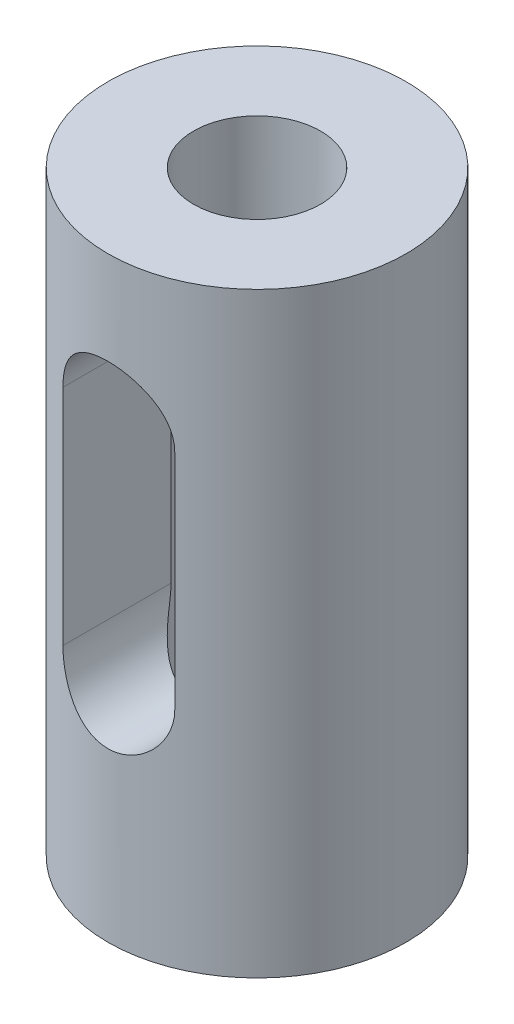
ISO-10303-21;
HEADER;
FILE_DESCRIPTION(('STEP AP214'),'2;1');
FILE_NAME('part.step','',(''),(''),'','','');
FILE_SCHEMA(('AUTOMOTIVE_DESIGN { 1 0 10303 214 1 1 1 1 }'));
ENDSEC;
DATA;
#1=APPLICATION_CONTEXT('core data for automotive mechanical design processes');
#2=APPLICATION_PROTOCOL_DEFINITION('international standard','automotive_design',2000,#1);
#3=PRODUCT_CONTEXT('',#1,'mechanical');
#4=PRODUCT('Part','Part','',(#3));
#5=PRODUCT_RELATED_PRODUCT_CATEGORY('part','',(#4));
#6=PRODUCT_DEFINITION_FORMATION('','',#4);
#7=PRODUCT_DEFINITION_CONTEXT('part definition',#1,'design');
#8=PRODUCT_DEFINITION('design','',#6,#7);
#9=PRODUCT_DEFINITION_SHAPE('','',#8);
#10=(LENGTH_UNIT() NAMED_UNIT(*) SI_UNIT(.MILLI.,.METRE.));
#11=(NAMED_UNIT(*) PLANE_ANGLE_UNIT() SI_UNIT($,.RADIAN.));
#12=(NAMED_UNIT(*) SI_UNIT($,.STERADIAN.) SOLID_ANGLE_UNIT());
#13=UNCERTAINTY_MEASURE_WITH_UNIT(LENGTH_MEASURE(1.E-05),#10,'distance_accuracy_value','');
#14=(GEOMETRIC_REPRESENTATION_CONTEXT(3) GLOBAL_UNCERTAINTY_ASSIGNED_CONTEXT((#13)) GLOBAL_UNIT_ASSIGNED_CONTEXT((#10,
#11,#12)) REPRESENTATION_CONTEXT('',''));
#15=CARTESIAN_POINT('',(0.,0.,0.));
#16=DIRECTION('',(0.,0.,1.));
#17=DIRECTION('',(1.,0.,0.));
#18=AXIS2_PLACEMENT_3D('',#15,#16,#17);
#19=CARTESIAN_POINT('',(0.,12.7,0.));
#20=DIRECTION('',(0.,-1.,0.));
#21=DIRECTION('',(0.,0.,-1.));
#22=AXIS2_PLACEMENT_3D('',#19,#20,#21);
#23=CYLINDRICAL_SURFACE('',#22,3.175);
#24=DIRECTION('',(0.,-1.,0.));
#25=VECTOR('',#24,1.);
#26=CARTESIAN_POINT('',(-1.190625,12.7,-2.94330377456609));
#27=LINE('',#26,#25);
#28=CARTESIAN_POINT('',(-1.190625,9.525,-2.94330377456609));
#29=VERTEX_POINT('',#28);
#30=CARTESIAN_POINT('',(-1.190625,4.7625,-2.94330377456609));
#31=VERTEX_POINT('',#30);
#32=EDGE_CURVE('E166',#29,#31,#27,.T.);
#33=ORIENTED_EDGE('',*,*,#32,.T.);
#34=CARTESIAN_POINT('',(-1.190625,4.7625,-2.94330377456609));
#35=CARTESIAN_POINT('',(-1.19062618848073,4.73027967690778,-2.94329995872857));
#36=CARTESIAN_POINT('',(-1.18931625076439,4.69807613112784,-2.94383351554502));
#37=CARTESIAN_POINT('',(-1.18409962328059,4.63392477238517,-2.94593703117006));
#38=CARTESIAN_POINT('',(-1.18019380538843,4.60197687720228,-2.94750664199916));
#39=CARTESIAN_POINT('',(-1.16466526629548,4.50709727251809,-2.95369436887438));
#40=CARTESIAN_POINT('',(-1.14923092772087,4.44484151969469,-2.95979205795841));
#41=CARTESIAN_POINT('',(-1.10879122478177,4.32405828217862,-2.97517516785815));
#42=CARTESIAN_POINT('',(-1.08379392479305,4.26552770444891,-2.98445790207025));
#43=CARTESIAN_POINT('',(-1.02500190069595,4.15342901845132,-3.00515645633822));
#44=CARTESIAN_POINT('',(-0.99119997623926,4.09986502065264,-3.01657402007336));
#45=CARTESIAN_POINT('',(-0.91397616823413,3.99661703854706,-3.04088474426552));
#46=CARTESIAN_POINT('',(-0.870190267274443,3.94721555113495,-3.05382115655563));
#47=CARTESIAN_POINT('',(-0.775013201823314,3.85625689804242,-3.07935139516824));
#48=CARTESIAN_POINT('',(-0.723620568591074,3.81470125080481,-3.09194515477271));
#49=CARTESIAN_POINT('',(-0.612531890043652,3.73924495493618,-3.11588859526652));
#50=CARTESIAN_POINT('',(-0.552612693952159,3.70565314820732,-3.1271813121393));
#51=CARTESIAN_POINT('',(-0.427476937704532,3.64914504557796,-3.14672690537256));
#52=CARTESIAN_POINT('',(-0.362262363264181,3.62622476946978,-3.15498091485232));
#53=CARTESIAN_POINT('',(-0.231370227719778,3.59270481068537,-3.16721085556145));
#54=CARTESIAN_POINT('',(-0.165833940311951,3.58161638870874,-3.17135594220028));
#55=CARTESIAN_POINT('',(-0.0337072593735778,3.57050879914146,-3.17550811124661));
#56=CARTESIAN_POINT('',(0.0328828035241815,3.57048622578848,-3.17551646682561));
#57=CARTESIAN_POINT('',(0.161721879430094,3.58122680869424,-3.17150165938149));
#58=CARTESIAN_POINT('',(0.224022668288449,3.59145639594589,-3.16767793539666));
#59=CARTESIAN_POINT('',(0.345948219071124,3.62151316519528,-3.15669026926481));
#60=CARTESIAN_POINT('',(0.405572828828377,3.64134089218802,-3.14952613744589));
#61=CARTESIAN_POINT('',(0.521484953024784,3.69027899912289,-3.13243730414583));
#62=CARTESIAN_POINT('',(0.577711250922168,3.71952031123296,-3.12247393335648));
#63=CARTESIAN_POINT('',(0.684598615222709,3.78633992982367,-3.10079480626558));
#64=CARTESIAN_POINT('',(0.735257863666696,3.8239209476687,-3.08907848045636));
#65=CARTESIAN_POINT('',(0.832712013169232,3.90891961062108,-3.06429285419527));
#66=CARTESIAN_POINT('',(0.879108122886125,3.95678373006591,-3.05118449980405));
#67=CARTESIAN_POINT('',(0.963372193449838,4.05970115666237,-3.02563755595115));
#68=CARTESIAN_POINT('',(1.00123680232957,4.1147572761264,-3.01319923119479));
#69=CARTESIAN_POINT('',(1.06813348661141,4.23208293505346,-2.99015045178193));
#70=CARTESIAN_POINT('',(1.09694552938089,4.29448785949868,-2.97958790430647));
#71=CARTESIAN_POINT('',(1.14346922163723,4.423732517962,-2.96204837787692));
#72=CARTESIAN_POINT('',(1.16119952777849,4.49056458766553,-2.95506537616461));
#73=CARTESIAN_POINT('',(1.17887172316472,4.59214618275791,-2.94803692564227));
#74=CARTESIAN_POINT('',(1.18327510053614,4.62605622405695,-2.94626884394537));
#75=CARTESIAN_POINT('',(1.18915107766906,4.69413754216694,-2.94390042682448));
#76=CARTESIAN_POINT('',(1.1906264013445,4.7283085464671,-2.94329900608927));
#77=CARTESIAN_POINT('',(1.190625,4.7625,-2.94330377456609));
#78=B_SPLINE_CURVE_WITH_KNOTS('',3,(#34,#35,#36,#37,#38,#39,#40,#41,#42,#43,#44,#45,#46,#47,#48,
#49,#50,#51,#52,#53,#54,#55,#56,#57,#58,#59,#60,#61,#62,#63,#64,#65,#66,#67,#68,#69,#70,#71,#72,
#73,#74,#75,#76,#77),.UNSPECIFIED.,.F.,.F.,(4,2,2,2,2,2,2,2,2,2,2,2,2,2,2,2,2,2,2,2,2,4),(0.,
0.0965973633725355,0.19316229908422,0.385439495019381,0.5775549011506,0.769827913629832,
0.97074059264154,1.171692115472,1.37948621931291,1.58720275906572,1.78596071876867,
1.98465750622697,2.17352376479971,2.36240074870515,2.5540273495621,2.74571634263585,
2.94860657699107,3.151576387038,3.35915405166445,3.5663813009329,3.66897446974835,
3.77147215322594),.UNSPECIFIED.);
#79=CARTESIAN_POINT('',(1.190625,4.7625,-2.94330377456609));
#80=VERTEX_POINT('',#79);
#81=EDGE_CURVE('E122',#31,#80,#78,.T.);
#82=ORIENTED_EDGE('',*,*,#81,.T.);
#83=DIRECTION('',(0.,-1.,0.));
#84=VECTOR('',#83,1.);
#85=CARTESIAN_POINT('',(1.190625,12.7,-2.94330377456609));
#86=LINE('',#85,#84);
#87=CARTESIAN_POINT('',(1.190625,9.525,-2.94330377456609));
#88=VERTEX_POINT('',#87);
#89=EDGE_CURVE('E172',#80,#88,#86,.F.);
#90=ORIENTED_EDGE('',*,*,#89,.T.);
#91=CARTESIAN_POINT('',(1.190625,9.525,-2.94330377456609));
#92=CARTESIAN_POINT('',(1.19062618848073,9.55722032309222,-2.94329995872857));
#93=CARTESIAN_POINT('',(1.18931625076439,9.58942386887216,-2.94383351554502));
#94=CARTESIAN_POINT('',(1.18409962328059,9.65357522761483,-2.94593703117006));
#95=CARTESIAN_POINT('',(1.18019380538843,9.68552312279772,-2.94750664199916));
#96=CARTESIAN_POINT('',(1.16466526629548,9.7804027274819,-2.95369436887438));
#97=CARTESIAN_POINT('',(1.14923092772087,9.84265848030531,-2.95979205795841));
#98=CARTESIAN_POINT('',(1.10879122478177,9.96344171782138,-2.97517516785815));
#99=CARTESIAN_POINT('',(1.08379392479305,10.0219722955511,-2.98445790207025));
#100=CARTESIAN_POINT('',(1.02500190069595,10.1340709815487,-3.00515645633822));
#101=CARTESIAN_POINT('',(0.99119997623926,10.1876349793474,-3.01657402007336));
#102=CARTESIAN_POINT('',(0.91397616823413,10.2908829614529,-3.04088474426552));
#103=CARTESIAN_POINT('',(0.870190267274443,10.3402844488651,-3.05382115655563));
#104=CARTESIAN_POINT('',(0.775013201823314,10.4312431019576,-3.07935139516824));
#105=CARTESIAN_POINT('',(0.723620568591073,10.4727987491952,-3.09194515477271));
#106=CARTESIAN_POINT('',(0.612531890043652,10.5482550450638,-3.11588859526652));
#107=CARTESIAN_POINT('',(0.55261269395216,10.5818468517927,-3.1271813121393));
#108=CARTESIAN_POINT('',(0.427476937704532,10.638354954422,-3.14672690537256));
#109=CARTESIAN_POINT('',(0.362262363264181,10.6612752305302,-3.15498091485232));
#110=CARTESIAN_POINT('',(0.231370227719777,10.6947951893146,-3.16721085556145));
#111=CARTESIAN_POINT('',(0.165833940311951,10.7058836112913,-3.17135594220028));
#112=CARTESIAN_POINT('',(0.0337072593735779,10.7169912008585,-3.17550811124661));
#113=CARTESIAN_POINT('',(-0.0328828035241814,10.7170137742115,-3.17551646682561));
#114=CARTESIAN_POINT('',(-0.161721879430094,10.7062731913058,-3.17150165938149));
#115=CARTESIAN_POINT('',(-0.224022668288449,10.6960436040541,-3.16767793539666));
#116=CARTESIAN_POINT('',(-0.345948219071124,10.6659868348047,-3.15669026926481));
#117=CARTESIAN_POINT('',(-0.405572828828377,10.646159107812,-3.14952613744589));
#118=CARTESIAN_POINT('',(-0.521484953024784,10.5972210008771,-3.13243730414583));
#119=CARTESIAN_POINT('',(-0.577711250922168,10.567979688767,-3.12247393335648));
#120=CARTESIAN_POINT('',(-0.684598615222709,10.5011600701763,-3.10079480626558));
#121=CARTESIAN_POINT('',(-0.735257863666696,10.4635790523313,-3.08907848045636));
#122=CARTESIAN_POINT('',(-0.832712013169232,10.3785803893789,-3.06429285419527));
#123=CARTESIAN_POINT('',(-0.879108122886125,10.3307162699341,-3.05118449980405));
#124=CARTESIAN_POINT('',(-0.963372193449838,10.2277988433376,-3.02563755595115));
#125=CARTESIAN_POINT('',(-1.00123680232957,10.1727427238736,-3.01319923119479));
#126=CARTESIAN_POINT('',(-1.06813348661141,10.0554170649465,-2.99015045178193));
#127=CARTESIAN_POINT('',(-1.09694552938089,9.99301214050132,-2.97958790430647));
#128=CARTESIAN_POINT('',(-1.14346922163723,9.86376748203799,-2.96204837787692));
#129=CARTESIAN_POINT('',(-1.16119952777849,9.79693541233447,-2.95506537616461));
#130=CARTESIAN_POINT('',(-1.17887172316472,9.69535381724209,-2.94803692564227));
#131=CARTESIAN_POINT('',(-1.18327510053614,9.66144377594305,-2.94626884394537));
#132=CARTESIAN_POINT('',(-1.18915107766906,9.59336245783306,-2.94390042682448));
#133=CARTESIAN_POINT('',(-1.1906264013445,9.5591914535329,-2.94329900608927));
#134=CARTESIAN_POINT('',(-1.190625,9.525,-2.94330377456609));
#135=B_SPLINE_CURVE_WITH_KNOTS('',3,(#91,#92,#93,#94,#95,#96,#97,#98,#99,#100,#101,#102,#103,
#104,#105,#106,#107,#108,#109,#110,#111,#112,#113,#114,#115,#116,#117,#118,#119,#120,#121,#122,
#123,#124,#125,#126,#127,#128,#129,#130,#131,#132,#133,#134),.UNSPECIFIED.,.F.,.F.,(4,2,2,2,2,2,
2,2,2,2,2,2,2,2,2,2,2,2,2,2,2,4),(0.,0.0965973633725364,0.193162299084221,0.385439495019381,
0.577554901150601,0.769827913629833,0.970740592641542,1.171692115472,1.37948621931292,
1.58720275906572,1.78596071876867,1.98465750622697,2.17352376479971,2.36240074870515,
2.5540273495621,2.74571634263585,2.94860657699107,3.151576387038,3.35915405166445,
3.5663813009329,3.66897446974835,3.77147215322594),.UNSPECIFIED.);
#136=EDGE_CURVE('E178',#88,#29,#135,.T.);
#137=ORIENTED_EDGE('',*,*,#136,.T.);
#138=EDGE_LOOP('',(#33,#82,#90,#137));
#139=FACE_BOUND('',#138,.T.);
#140=DIRECTION('',(0.,-1.,0.));
#141=VECTOR('',#140,1.);
#142=CARTESIAN_POINT('',(1.190625,12.7,2.94330377456609));
#143=LINE('',#142,#141);
#144=CARTESIAN_POINT('',(1.190625,9.525,2.94330377456609));
#145=VERTEX_POINT('',#144);
#146=CARTESIAN_POINT('',(1.190625,4.7625,2.94330377456609));
#147=VERTEX_POINT('',#146);
#148=EDGE_CURVE('E175',#145,#147,#143,.T.);
#149=ORIENTED_EDGE('',*,*,#148,.T.);
#150=CARTESIAN_POINT('',(1.190625,4.7625,2.94330377456609));
#151=CARTESIAN_POINT('',(1.19062618848074,4.73027967690778,2.94329995872857));
#152=CARTESIAN_POINT('',(1.18931625076439,4.69807613112784,2.94383351554502));
#153=CARTESIAN_POINT('',(1.18409962328059,4.63392477238517,2.94593703117006));
#154=CARTESIAN_POINT('',(1.18019380538843,4.60197687720228,2.94750664199915));
#155=CARTESIAN_POINT('',(1.16466526629548,4.5070972725181,2.95369436887438));
#156=CARTESIAN_POINT('',(1.14923092772087,4.44484151969469,2.95979205795841));
#157=CARTESIAN_POINT('',(1.10879122478177,4.32405828217862,2.97517516785815));
#158=CARTESIAN_POINT('',(1.08379392479305,4.26552770444891,2.98445790207025));
#159=CARTESIAN_POINT('',(1.02500190069595,4.15342901845132,3.00515645633822));
#160=CARTESIAN_POINT('',(0.991199976239261,4.09986502065264,3.01657402007336));
#161=CARTESIAN_POINT('',(0.913976168234131,3.99661703854706,3.04088474426551));
#162=CARTESIAN_POINT('',(0.870190267274444,3.94721555113495,3.05382115655563));
#163=CARTESIAN_POINT('',(0.775013201823315,3.85625689804242,3.07935139516824));
#164=CARTESIAN_POINT('',(0.723620568591074,3.81470125080481,3.09194515477271));
#165=CARTESIAN_POINT('',(0.612531890043653,3.73924495493618,3.11588859526652));
#166=CARTESIAN_POINT('',(0.55261269395216,3.70565314820732,3.1271813121393));
#167=CARTESIAN_POINT('',(0.427476937704533,3.64914504557796,3.14672690537256));
#168=CARTESIAN_POINT('',(0.362262363264182,3.62622476946978,3.15498091485232));
#169=CARTESIAN_POINT('',(0.231370227719778,3.59270481068537,3.16721085556145));
#170=CARTESIAN_POINT('',(0.165833940311952,3.58161638870874,3.17135594220028));
#171=CARTESIAN_POINT('',(0.0337072593735785,3.57050879914146,3.17550811124661));
#172=CARTESIAN_POINT('',(-0.0328828035241808,3.57048622578848,3.17551646682561));
#173=CARTESIAN_POINT('',(-0.161721879430093,3.58122680869424,3.17150165938149));
#174=CARTESIAN_POINT('',(-0.224022668288448,3.59145639594589,3.16767793539666));
#175=CARTESIAN_POINT('',(-0.345948219071123,3.62151316519528,3.15669026926481));
#176=CARTESIAN_POINT('',(-0.405572828828376,3.64134089218802,3.14952613744589));
#177=CARTESIAN_POINT('',(-0.521484953024783,3.69027899912289,3.13243730414583));
#178=CARTESIAN_POINT('',(-0.577711250922168,3.71952031123296,3.12247393335648));
#179=CARTESIAN_POINT('',(-0.684598615222708,3.78633992982367,3.10079480626558));
#180=CARTESIAN_POINT('',(-0.735257863666695,3.8239209476687,3.08907848045636));
#181=CARTESIAN_POINT('',(-0.832712013169232,3.90891961062108,3.06429285419527));
#182=CARTESIAN_POINT('',(-0.879108122886125,3.95678373006591,3.05118449980405));
#183=CARTESIAN_POINT('',(-0.963372193449837,4.05970115666237,3.02563755595115));
#184=CARTESIAN_POINT('',(-1.00123680232957,4.1147572761264,3.01319923119479));
#185=CARTESIAN_POINT('',(-1.06813348661141,4.23208293505346,2.99015045178193));
#186=CARTESIAN_POINT('',(-1.09694552938088,4.29448785949868,2.97958790430647));
#187=CARTESIAN_POINT('',(-1.14346922163723,4.423732517962,2.96204837787692));
#188=CARTESIAN_POINT('',(-1.16119952777849,4.49056458766553,2.95506537616461));
#189=CARTESIAN_POINT('',(-1.17887172316472,4.59214618275791,2.94803692564228));
#190=CARTESIAN_POINT('',(-1.18327510053614,4.62605622405695,2.94626884394537));
#191=CARTESIAN_POINT('',(-1.18915107766906,4.69413754216694,2.94390042682448));
#192=CARTESIAN_POINT('',(-1.1906264013445,4.7283085464671,2.94329900608927));
#193=CARTESIAN_POINT('',(-1.190625,4.7625,2.94330377456609));
#194=B_SPLINE_CURVE_WITH_KNOTS('',3,(#150,#151,#152,#153,#154,#155,#156,#157,#158,#159,#160,
#161,#162,#163,#164,#165,#166,#167,#168,#169,#170,#171,#172,#173,#174,#175,#176,#177,#178,#179,
#180,#181,#182,#183,#184,#185,#186,#187,#188,#189,#190,#191,#192,#193),.UNSPECIFIED.,.F.,.F.,(4,
2,2,2,2,2,2,2,2,2,2,2,2,2,2,2,2,2,2,2,2,4),(0.,0.0965973633725346,0.193162299084219,
0.385439495019381,0.577554901150599,0.769827913629832,0.97074059264154,1.171692115472,
1.37948621931291,1.58720275906572,1.78596071876867,1.98465750622697,2.17352376479971,
2.36240074870515,2.5540273495621,2.74571634263585,2.94860657699107,3.151576387038,
3.35915405166445,3.56638130093289,3.66897446974835,3.77147215322594),.UNSPECIFIED.);
#195=CARTESIAN_POINT('',(-1.190625,4.7625,2.94330377456609));
#196=VERTEX_POINT('',#195);
#197=EDGE_CURVE('E165',#147,#196,#194,.T.);
#198=ORIENTED_EDGE('',*,*,#197,.T.);
#199=DIRECTION('',(0.,-1.,0.));
#200=VECTOR('',#199,1.);
#201=CARTESIAN_POINT('',(-1.190625,12.7,2.94330377456609));
#202=LINE('',#201,#200);
#203=CARTESIAN_POINT('',(-1.190625,9.525,2.94330377456609));
#204=VERTEX_POINT('',#203);
#205=EDGE_CURVE('E217',#196,#204,#202,.F.);
#206=ORIENTED_EDGE('',*,*,#205,.T.);
#207=CARTESIAN_POINT('',(-1.190625,9.525,2.94330377456609));
#208=CARTESIAN_POINT('',(-1.19062618848074,9.55722032309222,2.94329995872857));
#209=CARTESIAN_POINT('',(-1.18931625076439,9.58942386887216,2.94383351554502));
#210=CARTESIAN_POINT('',(-1.18409962328059,9.65357522761483,2.94593703117006));
#211=CARTESIAN_POINT('',(-1.18019380538843,9.68552312279772,2.94750664199915));
#212=CARTESIAN_POINT('',(-1.16466526629548,9.7804027274819,2.95369436887438));
#213=CARTESIAN_POINT('',(-1.14923092772087,9.84265848030531,2.95979205795841));
#214=CARTESIAN_POINT('',(-1.10879122478177,9.96344171782138,2.97517516785815));
#215=CARTESIAN_POINT('',(-1.08379392479306,10.0219722955511,2.98445790207025));
#216=CARTESIAN_POINT('',(-1.02500190069595,10.1340709815487,3.00515645633822));
#217=CARTESIAN_POINT('',(-0.991199976239262,10.1876349793474,3.01657402007336));
#218=CARTESIAN_POINT('',(-0.913976168234133,10.2908829614529,3.04088474426551));
#219=CARTESIAN_POINT('',(-0.870190267274446,10.340284448865,3.05382115655563));
#220=CARTESIAN_POINT('',(-0.775013201823316,10.4312431019576,3.07935139516824));
#221=CARTESIAN_POINT('',(-0.723620568591075,10.4727987491952,3.09194515477271));
#222=CARTESIAN_POINT('',(-0.612531890043652,10.5482550450638,3.11588859526652));
#223=CARTESIAN_POINT('',(-0.55261269395216,10.5818468517927,3.1271813121393));
#224=CARTESIAN_POINT('',(-0.427476937704533,10.638354954422,3.14672690537256));
#225=CARTESIAN_POINT('',(-0.362262363264182,10.6612752305302,3.15498091485232));
#226=CARTESIAN_POINT('',(-0.231370227719778,10.6947951893146,3.16721085556145));
#227=CARTESIAN_POINT('',(-0.165833940311952,10.7058836112913,3.17135594220028));
#228=CARTESIAN_POINT('',(-0.0337072593735791,10.7169912008585,3.17550811124661));
#229=CARTESIAN_POINT('',(0.0328828035241802,10.7170137742115,3.17551646682561));
#230=CARTESIAN_POINT('',(0.161721879430093,10.7062731913058,3.17150165938149));
#231=CARTESIAN_POINT('',(0.224022668288447,10.6960436040541,3.16767793539666));
#232=CARTESIAN_POINT('',(0.345948219071122,10.6659868348047,3.15669026926481));
#233=CARTESIAN_POINT('',(0.405572828828375,10.646159107812,3.14952613744589));
#234=CARTESIAN_POINT('',(0.521484953024783,10.5972210008771,3.13243730414583));
#235=CARTESIAN_POINT('',(0.577711250922167,10.567979688767,3.12247393335648));
#236=CARTESIAN_POINT('',(0.684598615222707,10.5011600701763,3.10079480626558));
#237=CARTESIAN_POINT('',(0.735257863666694,10.4635790523313,3.08907848045636));
#238=CARTESIAN_POINT('',(0.832712013169231,10.3785803893789,3.06429285419527));
#239=CARTESIAN_POINT('',(0.879108122886124,10.3307162699341,3.05118449980405));
#240=CARTESIAN_POINT('',(0.963372193449837,10.2277988433376,3.02563755595115));
#241=CARTESIAN_POINT('',(1.00123680232957,10.1727427238736,3.01319923119479));
#242=CARTESIAN_POINT('',(1.06813348661141,10.0554170649465,2.99015045178193));
#243=CARTESIAN_POINT('',(1.09694552938088,9.99301214050132,2.97958790430647));
#244=CARTESIAN_POINT('',(1.14346922163723,9.86376748203799,2.96204837787692));
#245=CARTESIAN_POINT('',(1.16119952777849,9.79693541233447,2.95506537616461));
#246=CARTESIAN_POINT('',(1.17887172316472,9.69535381724209,2.94803692564228));
#247=CARTESIAN_POINT('',(1.18327510053614,9.66144377594305,2.94626884394537));
#248=CARTESIAN_POINT('',(1.18915107766906,9.59336245783306,2.94390042682448));
#249=CARTESIAN_POINT('',(1.1906264013445,9.5591914535329,2.94329900608927));
#250=CARTESIAN_POINT('',(1.190625,9.525,2.94330377456609));
#251=B_SPLINE_CURVE_WITH_KNOTS('',3,(#207,#208,#209,#210,#211,#212,#213,#214,#215,#216,#217,
#218,#219,#220,#221,#222,#223,#224,#225,#226,#227,#228,#229,#230,#231,#232,#233,#234,#235,#236,
#237,#238,#239,#240,#241,#242,#243,#244,#245,#246,#247,#248,#249,#250),.UNSPECIFIED.,.F.,.F.,(4,
2,2,2,2,2,2,2,2,2,2,2,2,2,2,2,2,2,2,2,2,4),(0.,0.0965973633725364,0.193162299084221,
0.385439495019381,0.577554901150599,0.769827913629831,0.970740592641539,1.171692115472,
1.37948621931292,1.58720275906572,1.78596071876867,1.98465750622697,2.17352376479971,
2.36240074870515,2.5540273495621,2.74571634263585,2.94860657699107,3.151576387038,
3.35915405166445,3.5663813009329,3.66897446974835,3.77147215322594),.UNSPECIFIED.);
#252=EDGE_CURVE('E183',#204,#145,#251,.T.);
#253=ORIENTED_EDGE('',*,*,#252,.T.);
#254=EDGE_LOOP('',(#149,#198,#206,#253));
#255=FACE_BOUND('',#254,.T.);
#256=CARTESIAN_POINT('',(0.,12.7,0.));
#257=DIRECTION('',(0.,1.,0.));
#258=DIRECTION('',(0.,0.,1.));
#259=AXIS2_PLACEMENT_3D('',#256,#257,#258);
#260=CIRCLE('',#259,3.175);
#261=CARTESIAN_POINT('',(0.,12.7,3.175));
#262=VERTEX_POINT('',#261);
#263=EDGE_CURVE('E116',#262,#262,#260,.T.);
#264=ORIENTED_EDGE('',*,*,#263,.F.);
#265=EDGE_LOOP('',(#264));
#266=FACE_BOUND('',#265,.T.);
#267=CARTESIAN_POINT('',(0.,0.,0.));
#268=DIRECTION('',(0.,1.,0.));
#269=DIRECTION('',(0.,0.,1.));
#270=AXIS2_PLACEMENT_3D('',#267,#268,#269);
#271=CIRCLE('',#270,3.175);
#272=CARTESIAN_POINT('',(0.,0.,3.175));
#273=VERTEX_POINT('',#272);
#274=EDGE_CURVE('E230',#273,#273,#271,.T.);
#275=ORIENTED_EDGE('',*,*,#274,.T.);
#276=EDGE_LOOP('',(#275));
#277=FACE_BOUND('',#276,.T.);
#278=ADVANCED_FACE('F37',(#139,#255,#266,#277),#23,.T.);
#279=CARTESIAN_POINT('',(0.,12.7,0.));
#280=DIRECTION('',(0.,1.,0.));
#281=DIRECTION('',(0.,0.,1.));
#282=AXIS2_PLACEMENT_3D('',#279,#280,#281);
#283=PLANE('',#282);
#284=CARTESIAN_POINT('',(0.,12.7,0.));
#285=DIRECTION('',(0.,1.,0.));
#286=DIRECTION('',(0.,0.,1.));
#287=AXIS2_PLACEMENT_3D('',#284,#285,#286);
#288=CIRCLE('',#287,1.35254999999999);
#289=CARTESIAN_POINT('',(0.,12.7,1.35254999999999));
#290=VERTEX_POINT('',#289);
#291=EDGE_CURVE('E224',#290,#290,#288,.T.);
#292=ORIENTED_EDGE('',*,*,#291,.F.);
#293=EDGE_LOOP('',(#292));
#294=FACE_BOUND('',#293,.T.);
#295=ORIENTED_EDGE('',*,*,#263,.T.);
#296=EDGE_LOOP('',(#295));
#297=FACE_BOUND('',#296,.T.);
#298=ADVANCED_FACE('F240',(#294,#297),#283,.T.);
#299=CARTESIAN_POINT('',(0.,0.,0.));
#300=DIRECTION('',(0.,1.,0.));
#301=DIRECTION('',(0.,0.,1.));
#302=AXIS2_PLACEMENT_3D('',#299,#300,#301);
#303=PLANE('',#302);
#304=CARTESIAN_POINT('',(0.,0.,0.));
#305=DIRECTION('',(0.,1.,0.));
#306=DIRECTION('',(0.,0.,1.));
#307=AXIS2_PLACEMENT_3D('',#304,#305,#306);
#308=CIRCLE('',#307,1.35255);
#309=CARTESIAN_POINT('',(0.,0.,1.35255));
#310=VERTEX_POINT('',#309);
#311=EDGE_CURVE('E226',#310,#310,#308,.T.);
#312=ORIENTED_EDGE('',*,*,#311,.T.);
#313=EDGE_LOOP('',(#312));
#314=FACE_BOUND('',#313,.T.);
#315=ORIENTED_EDGE('',*,*,#274,.F.);
#316=EDGE_LOOP('',(#315));
#317=FACE_BOUND('',#316,.T.);
#318=ADVANCED_FACE('F238',(#314,#317),#303,.F.);
#319=CARTESIAN_POINT('',(0.,12.7,0.));
#320=DIRECTION('',(0.,1.,0.));
#321=DIRECTION('',(0.,0.,1.));
#322=AXIS2_PLACEMENT_3D('',#319,#320,#321);
#323=CYLINDRICAL_SURFACE('',#322,1.35255);
#324=DIRECTION('',(0.,1.,0.));
#325=VECTOR('',#324,1.);
#326=CARTESIAN_POINT('',(1.190625,12.7,0.641719262508918));
#327=LINE('',#326,#325);
#328=CARTESIAN_POINT('',(1.190625,4.7625,0.641719262508916));
#329=VERTEX_POINT('',#328);
#330=CARTESIAN_POINT('',(1.190625,9.525,0.641719262508918));
#331=VERTEX_POINT('',#330);
#332=EDGE_CURVE('E50',#329,#331,#327,.T.);
#333=ORIENTED_EDGE('',*,*,#332,.T.);
#334=CARTESIAN_POINT('',(1.190625,9.525,0.641719262508917));
#335=CARTESIAN_POINT('',(1.19066571986986,9.56334607020842,0.641557283796457));
#336=CARTESIAN_POINT('',(1.18877671130534,9.60140752659745,0.645159975697118));
#337=CARTESIAN_POINT('',(1.18163354304275,9.67554670988399,0.658189685094699));
#338=CARTESIAN_POINT('',(1.17643868152506,9.71164746325981,0.667513969199228));
#339=CARTESIAN_POINT('',(1.16007943597601,9.79805249196192,0.695670267302344));
#340=CARTESIAN_POINT('',(1.14726605696047,9.84721514491697,0.716904554229078));
#341=CARTESIAN_POINT('',(1.11637320142791,9.94189860709206,0.76414357870234));
#342=CARTESIAN_POINT('',(1.09824091278728,9.98737675413773,0.790195139104776));
#343=CARTESIAN_POINT('',(1.06119209954145,10.0662624578364,0.839055412831134));
#344=CARTESIAN_POINT('',(1.04311725574554,10.1002949960382,0.861506509468477));
#345=CARTESIAN_POINT('',(1.00392780188969,10.1662402880759,0.906874826696303));
#346=CARTESIAN_POINT('',(0.982811517166426,10.198151859835,0.929792298070681));
#347=CARTESIAN_POINT('',(0.9150270510806,10.2906020786765,0.99810307377894));
#348=CARTESIAN_POINT('',(0.863794173154386,10.3481293691352,1.04323591236457));
#349=CARTESIAN_POINT('',(0.762372803561189,10.4414875095907,1.11857217043411));
#350=CARTESIAN_POINT('',(0.714714855916175,10.4792522043281,1.14980592809482));
#351=CARTESIAN_POINT('',(0.612166951629825,10.5480530997483,1.20751261864862));
#352=CARTESIAN_POINT('',(0.557287251332536,10.5790986805797,1.23399217966486));
#353=CARTESIAN_POINT('',(0.451951626487714,10.6277358945948,1.27581697055307));
#354=CARTESIAN_POINT('',(0.402622303022453,10.6467615900354,1.29232087308629));
#355=CARTESIAN_POINT('',(0.300453887999346,10.6783286148771,1.31981424758843));
#356=CARTESIAN_POINT('',(0.247617087213402,10.6908741304374,1.33080727941271));
#357=CARTESIAN_POINT('',(0.139488819454767,10.7087004350055,1.34645159576843));
#358=CARTESIAN_POINT('',(0.0841856260710264,10.7139415817757,1.35106827337483));
#359=CARTESIAN_POINT('',(-0.0267534649621894,10.7166157291265,1.35342198508186));
#360=CARTESIAN_POINT('',(-0.082389284944256,10.7140504864761,1.35116056704597));
#361=CARTESIAN_POINT('',(-0.187253125075297,10.7018884104612,1.34047111972752));
#362=CARTESIAN_POINT('',(-0.236615609029979,10.6929270581348,1.33260048883759));
#363=CARTESIAN_POINT('',(-0.332832274421573,10.6692322511512,1.31188341527577));
#364=CARTESIAN_POINT('',(-0.379685762116851,10.6544972093309,1.29903560440888));
#365=CARTESIAN_POINT('',(-0.473016886813023,10.6188471403327,1.26815628184314));
#366=CARTESIAN_POINT('',(-0.519267325167169,10.5975895212218,1.24983951796619));
#367=CARTESIAN_POINT('',(-0.607409329365308,10.5502549155659,1.2094623600228));
#368=CARTESIAN_POINT('',(-0.649300358954844,10.5241773372063,1.18740150626882));
#369=CARTESIAN_POINT('',(-0.749085284207008,10.4533872121695,1.1283384220489));
#370=CARTESIAN_POINT('',(-0.804024248150758,10.4060202306588,1.08951718440938));
#371=CARTESIAN_POINT('',(-0.903663359292782,10.3035444443044,1.00842683014317));
#372=CARTESIAN_POINT('',(-0.948309652641229,10.2483972491252,0.966141080616886));
#373=CARTESIAN_POINT('',(-1.00796250555843,10.1597457841608,0.902375127553331));
#374=CARTESIAN_POINT('',(-1.02680119161744,10.1288123171476,0.880811645922078));
#375=CARTESIAN_POINT('',(-1.06176912097473,10.0649645912261,0.838327690813683));
#376=CARTESIAN_POINT('',(-1.0778960706015,10.0320486871501,0.817407773780586));
#377=CARTESIAN_POINT('',(-1.10723467378814,9.96428911285122,0.777198657913558));
#378=CARTESIAN_POINT('',(-1.12046352565989,9.92945843973347,0.75790028249424));
#379=CARTESIAN_POINT('',(-1.14388589922635,9.85747660369727,0.72206177672509));
#380=CARTESIAN_POINT('',(-1.15408580578303,9.82033052456283,0.705515877169906));
#381=CARTESIAN_POINT('',(-1.1699906069883,9.7483647851253,0.678766995607847));
#382=CARTESIAN_POINT('',(-1.17609979404043,9.71384119627207,0.668027652887393));
#383=CARTESIAN_POINT('',(-1.18526074727091,9.64328760285962,0.651647431829503));
#384=CARTESIAN_POINT('',(-1.18832649424939,9.60726528625811,0.645983251279203));
#385=CARTESIAN_POINT('',(-1.19033103214479,9.55569249179808,0.642261050132441));
#386=CARTESIAN_POINT('',(-1.190631067271,9.54034670128189,0.641698834812889));
#387=CARTESIAN_POINT('',(-1.19062500000002,9.52499999999969,0.641719262513175));
#388=B_SPLINE_CURVE_WITH_KNOTS('',3,(#334,#335,#336,#337,#338,#339,#340,#341,#342,#343,#344,
#345,#346,#347,#348,#349,#350,#351,#352,#353,#354,#355,#356,#357,#358,#359,#360,#361,#362,#363,
#364,#365,#366,#367,#368,#369,#370,#371,#372,#373,#374,#375,#376,#377,#378,#379,#380,#381,#382,
#383,#384,#385,#386,#387),.UNSPECIFIED.,.F.,.F.,(4,2,2,2,2,2,2,2,2,2,2,2,2,2,2,2,2,2,2,2,2,2,2,
2,2,2,4),(0.,0.114373028930709,0.226750212329603,0.391034858731896,0.557009360758274,
0.69063416576809,0.824332829896231,1.09068518166131,1.29506494995732,1.49915752879066,
1.66464740081118,1.83003023319679,1.99630718071365,2.16254671162803,2.31422746765066,
2.46594994936578,2.62764669660429,2.7893633108394,3.03487301904939,3.28163953049276,
3.40798723023035,3.5344412670139,3.66012323224913,3.78553835441611,3.89516064083094,
4.00427698687415,4.05030898369704),.UNSPECIFIED.);
#389=CARTESIAN_POINT('',(-1.190625,9.525,0.641719262508913));
#390=VERTEX_POINT('',#389);
#391=EDGE_CURVE('E11',#331,#390,#388,.T.);
#392=ORIENTED_EDGE('',*,*,#391,.T.);
#393=DIRECTION('',(0.,1.,0.));
#394=VECTOR('',#393,1.);
#395=CARTESIAN_POINT('',(-1.190625,12.7,0.641719262508913));
#396=LINE('',#395,#394);
#397=CARTESIAN_POINT('',(-1.190625,4.7625,0.641719262508913));
#398=VERTEX_POINT('',#397);
#399=EDGE_CURVE('E199',#390,#398,#396,.F.);
#400=ORIENTED_EDGE('',*,*,#399,.T.);
#401=CARTESIAN_POINT('',(-1.190625,4.7625,0.641719262508918));
#402=CARTESIAN_POINT('',(-1.19066571986986,4.72415392979157,0.641557283796458));
#403=CARTESIAN_POINT('',(-1.18877671130534,4.68609247340255,0.645159975697119));
#404=CARTESIAN_POINT('',(-1.18163354304275,4.61195329011601,0.6581896850947));
#405=CARTESIAN_POINT('',(-1.17643868152506,4.57585253674019,0.667513969199229));
#406=CARTESIAN_POINT('',(-1.16007943597601,4.48944750803808,0.695670267302345));
#407=CARTESIAN_POINT('',(-1.14726605696047,4.44028485508303,0.716904554229078));
#408=CARTESIAN_POINT('',(-1.11637320142791,4.34560139290794,0.76414357870234));
#409=CARTESIAN_POINT('',(-1.09824091278728,4.30012324586227,0.790195139104777));
#410=CARTESIAN_POINT('',(-1.06119209954145,4.22123754216355,0.839055412831136));
#411=CARTESIAN_POINT('',(-1.04311725574554,4.18720500396175,0.861506509468478));
#412=CARTESIAN_POINT('',(-1.00392780188969,4.12125971192414,0.906874826696304));
#413=CARTESIAN_POINT('',(-0.982811517166426,4.08934814016502,0.929792298070681));
#414=CARTESIAN_POINT('',(-0.9150270510806,3.99689792132347,0.99810307377894));
#415=CARTESIAN_POINT('',(-0.863794173154386,3.93937063086481,1.04323591236457));
#416=CARTESIAN_POINT('',(-0.762372803561189,3.84601249040926,1.11857217043411));
#417=CARTESIAN_POINT('',(-0.714714855916175,3.80824779567193,1.14980592809482));
#418=CARTESIAN_POINT('',(-0.612166951629824,3.73944690025171,1.20751261864862));
#419=CARTESIAN_POINT('',(-0.557287251332535,3.70840131942027,1.23399217966486));
#420=CARTESIAN_POINT('',(-0.451951626487713,3.65976410540515,1.27581697055307));
#421=CARTESIAN_POINT('',(-0.402622303022452,3.64073840996457,1.29232087308629));
#422=CARTESIAN_POINT('',(-0.300453887999345,3.60917138512288,1.31981424758843));
#423=CARTESIAN_POINT('',(-0.247617087213402,3.59662586956257,1.33080727941271));
#424=CARTESIAN_POINT('',(-0.139488819454767,3.57879956499449,1.34645159576843));
#425=CARTESIAN_POINT('',(-0.0841856260710257,3.57355841822433,1.35106827337483));
#426=CARTESIAN_POINT('',(0.0267534649621902,3.57088427087349,1.35342198508186));
#427=CARTESIAN_POINT('',(0.082389284944257,3.57344951352389,1.35116056704597));
#428=CARTESIAN_POINT('',(0.187253125075298,3.58561158953879,1.34047111972752));
#429=CARTESIAN_POINT('',(0.23661560902998,3.59457294186522,1.33260048883759));
#430=CARTESIAN_POINT('',(0.332832274421574,3.61826774884878,1.31188341527577));
#431=CARTESIAN_POINT('',(0.379685762116852,3.63300279066906,1.29903560440888));
#432=CARTESIAN_POINT('',(0.473016886813024,3.66865285966733,1.26815628184314));
#433=CARTESIAN_POINT('',(0.51926732516717,3.68991047877815,1.24983951796619));
#434=CARTESIAN_POINT('',(0.607409329365309,3.73724508443413,1.2094623600228));
#435=CARTESIAN_POINT('',(0.649300358954845,3.76332266279372,1.18740150626882));
#436=CARTESIAN_POINT('',(0.749085284207008,3.83411278783045,1.1283384220489));
#437=CARTESIAN_POINT('',(0.804024248150759,3.88147976934116,1.08951718440938));
#438=CARTESIAN_POINT('',(0.903663359292782,3.98395555569557,1.00842683014317));
#439=CARTESIAN_POINT('',(0.948309652641229,4.03910275087477,0.966141080616885));
#440=CARTESIAN_POINT('',(1.00796250555843,4.12775421583924,0.902375127553331));
#441=CARTESIAN_POINT('',(1.02680119161743,4.15868768285237,0.880811645922079));
#442=CARTESIAN_POINT('',(1.06176912097473,4.22253540877389,0.838327690813684));
#443=CARTESIAN_POINT('',(1.0778960706015,4.25545131284993,0.817407773780586));
#444=CARTESIAN_POINT('',(1.10723467378814,4.32321088714877,0.777198657913558));
#445=CARTESIAN_POINT('',(1.12046352565989,4.35804156026653,0.75790028249424));
#446=CARTESIAN_POINT('',(1.14388589922635,4.43002339630273,0.72206177672509));
#447=CARTESIAN_POINT('',(1.15408580578303,4.46716947543717,0.705515877169907));
#448=CARTESIAN_POINT('',(1.1699906069883,4.5391352148747,0.678766995607847));
#449=CARTESIAN_POINT('',(1.17609979404043,4.57365880372793,0.668027652887393));
#450=CARTESIAN_POINT('',(1.18526074727091,4.64421239714038,0.651647431829504));
#451=CARTESIAN_POINT('',(1.18832649424939,4.68023471374188,0.645983251279203));
#452=CARTESIAN_POINT('',(1.19033103214479,4.73180750820192,0.642261050132441));
#453=CARTESIAN_POINT('',(1.190631067271,4.74715329871811,0.64169883481289));
#454=CARTESIAN_POINT('',(1.19062500000002,4.7625000000003,0.641719262513177));
#455=B_SPLINE_CURVE_WITH_KNOTS('',3,(#401,#402,#403,#404,#405,#406,#407,#408,#409,#410,#411,
#412,#413,#414,#415,#416,#417,#418,#419,#420,#421,#422,#423,#424,#425,#426,#427,#428,#429,#430,
#431,#432,#433,#434,#435,#436,#437,#438,#439,#440,#441,#442,#443,#444,#445,#446,#447,#448,#449,
#450,#451,#452,#453,#454),.UNSPECIFIED.,.F.,.F.,(4,2,2,2,2,2,2,2,2,2,2,2,2,2,2,2,2,2,2,2,2,2,2,
2,2,2,4),(0.,0.11437302893071,0.226750212329603,0.391034858731894,0.557009360758274,
0.690634165768091,0.82433282989623,1.09068518166131,1.29506494995732,1.49915752879066,
1.66464740081118,1.83003023319679,1.99630718071365,2.16254671162803,2.31422746765066,
2.46594994936578,2.62764669660429,2.7893633108394,3.03487301904939,3.28163953049276,
3.40798723023035,3.5344412670139,3.66012323224913,3.78553835441611,3.89516064083094,
4.00427698687415,4.05030898369704),.UNSPECIFIED.);
#456=EDGE_CURVE('E155',#398,#329,#455,.T.);
#457=ORIENTED_EDGE('',*,*,#456,.T.);
#458=EDGE_LOOP('',(#333,#392,#400,#457));
#459=FACE_BOUND('',#458,.T.);
#460=DIRECTION('',(0.,1.,0.));
#461=VECTOR('',#460,1.);
#462=CARTESIAN_POINT('',(-1.190625,12.7,-0.641719262508913));
#463=LINE('',#462,#461);
#464=CARTESIAN_POINT('',(-1.190625,4.7625,-0.641719262508913));
#465=VERTEX_POINT('',#464);
#466=CARTESIAN_POINT('',(-1.190625,9.525,-0.641719262508913));
#467=VERTEX_POINT('',#466);
#468=EDGE_CURVE('E107',#465,#467,#463,.T.);
#469=ORIENTED_EDGE('',*,*,#468,.T.);
#470=CARTESIAN_POINT('',(-1.190625,9.525,-0.641719262508915));
#471=CARTESIAN_POINT('',(-1.19066571986986,9.56334607020842,-0.641557283796456));
#472=CARTESIAN_POINT('',(-1.18877671130535,9.60140752659745,-0.645159975697117));
#473=CARTESIAN_POINT('',(-1.18163354304275,9.67554670988399,-0.658189685094697));
#474=CARTESIAN_POINT('',(-1.17643868152506,9.71164746325981,-0.667513969199227));
#475=CARTESIAN_POINT('',(-1.16007943597601,9.79805249196192,-0.695670267302342));
#476=CARTESIAN_POINT('',(-1.14726605696047,9.84721514491697,-0.716904554229075));
#477=CARTESIAN_POINT('',(-1.11637320142792,9.94189860709205,-0.764143578702337));
#478=CARTESIAN_POINT('',(-1.09824091278728,9.98737675413772,-0.790195139104773));
#479=CARTESIAN_POINT('',(-1.06119209954145,10.0662624578364,-0.839055412831132));
#480=CARTESIAN_POINT('',(-1.04311725574554,10.1002949960382,-0.861506509468474));
#481=CARTESIAN_POINT('',(-1.00392780188969,10.1662402880759,-0.906874826696301));
#482=CARTESIAN_POINT('',(-0.982811517166428,10.198151859835,-0.929792298070678));
#483=CARTESIAN_POINT('',(-0.915027051080604,10.2906020786765,-0.998103073778937));
#484=CARTESIAN_POINT('',(-0.86379417315439,10.3481293691352,-1.04323591236457));
#485=CARTESIAN_POINT('',(-0.762372803561193,10.4414875095907,-1.11857217043411));
#486=CARTESIAN_POINT('',(-0.714714855916178,10.4792522043281,-1.14980592809482));
#487=CARTESIAN_POINT('',(-0.612166951629827,10.5480530997483,-1.20751261864862));
#488=CARTESIAN_POINT('',(-0.557287251332538,10.5790986805797,-1.23399217966486));
#489=CARTESIAN_POINT('',(-0.451951626487715,10.6277358945948,-1.27581697055307));
#490=CARTESIAN_POINT('',(-0.402622303022455,10.6467615900354,-1.29232087308629));
#491=CARTESIAN_POINT('',(-0.300453887999348,10.6783286148771,-1.31981424758843));
#492=CARTESIAN_POINT('',(-0.247617087213404,10.6908741304374,-1.33080727941271));
#493=CARTESIAN_POINT('',(-0.139488819454769,10.7087004350055,-1.34645159576843));
#494=CARTESIAN_POINT('',(-0.0841856260710282,10.7139415817757,-1.35106827337483));
#495=CARTESIAN_POINT('',(0.0267534649621879,10.7166157291265,-1.35342198508186));
#496=CARTESIAN_POINT('',(0.0823892849442547,10.7140504864761,-1.35116056704597));
#497=CARTESIAN_POINT('',(0.187253125075296,10.7018884104612,-1.34047111972752));
#498=CARTESIAN_POINT('',(0.236615609029977,10.6929270581348,-1.33260048883759));
#499=CARTESIAN_POINT('',(0.332832274421572,10.6692322511512,-1.31188341527577));
#500=CARTESIAN_POINT('',(0.37968576211685,10.6544972093309,-1.29903560440888));
#501=CARTESIAN_POINT('',(0.473016886813022,10.6188471403327,-1.26815628184314));
#502=CARTESIAN_POINT('',(0.519267325167168,10.5975895212218,-1.2498395179662));
#503=CARTESIAN_POINT('',(0.607409329365307,10.5502549155659,-1.2094623600228));
#504=CARTESIAN_POINT('',(0.649300358954842,10.5241773372063,-1.18740150626882));
#505=CARTESIAN_POINT('',(0.749085284207006,10.4533872121695,-1.1283384220489));
#506=CARTESIAN_POINT('',(0.804024248150757,10.4060202306588,-1.08951718440938));
#507=CARTESIAN_POINT('',(0.90366335929278,10.3035444443044,-1.00842683014318));
#508=CARTESIAN_POINT('',(0.948309652641228,10.2483972491252,-0.966141080616887));
#509=CARTESIAN_POINT('',(1.00796250555843,10.1597457841608,-0.902375127553333));
#510=CARTESIAN_POINT('',(1.02680119161743,10.1288123171476,-0.88081164592208));
#511=CARTESIAN_POINT('',(1.06176912097472,10.0649645912261,-0.838327690813685));
#512=CARTESIAN_POINT('',(1.0778960706015,10.0320486871501,-0.817407773780587));
#513=CARTESIAN_POINT('',(1.10723467378814,9.96428911285123,-0.777198657913559));
#514=CARTESIAN_POINT('',(1.12046352565989,9.92945843973347,-0.757900282494241));
#515=CARTESIAN_POINT('',(1.14388589922635,9.85747660369727,-0.722061776725092));
#516=CARTESIAN_POINT('',(1.15408580578302,9.82033052456283,-0.705515877169908));
#517=CARTESIAN_POINT('',(1.1699906069883,9.7483647851253,-0.678766995607849));
#518=CARTESIAN_POINT('',(1.17609979404043,9.71384119627207,-0.668027652887394));
#519=CARTESIAN_POINT('',(1.18526074727091,9.64328760285962,-0.651647431829505));
#520=CARTESIAN_POINT('',(1.18832649424939,9.60726528625812,-0.645983251279205));
#521=CARTESIAN_POINT('',(1.19033103214479,9.55569249179808,-0.642261050132443));
#522=CARTESIAN_POINT('',(1.190631067271,9.54034670128189,-0.641698834812891));
#523=CARTESIAN_POINT('',(1.19062500000001,9.52499999999969,-0.641719262513177));
#524=B_SPLINE_CURVE_WITH_KNOTS('',3,(#470,#471,#472,#473,#474,#475,#476,#477,#478,#479,#480,
#481,#482,#483,#484,#485,#486,#487,#488,#489,#490,#491,#492,#493,#494,#495,#496,#497,#498,#499,
#500,#501,#502,#503,#504,#505,#506,#507,#508,#509,#510,#511,#512,#513,#514,#515,#516,#517,#518,
#519,#520,#521,#522,#523),.UNSPECIFIED.,.F.,.F.,(4,2,2,2,2,2,2,2,2,2,2,2,2,2,2,2,2,2,2,2,2,2,2,
2,2,2,4),(0.,0.114373028930709,0.226750212329601,0.39103485873189,0.557009360758271,
0.690634165768088,0.824332829896227,1.0906851816613,1.29506494995732,1.49915752879066,
1.66464740081118,1.83003023319679,1.99630718071365,2.16254671162803,2.31422746765066,
2.46594994936578,2.62764669660429,2.7893633108394,3.03487301904939,3.28163953049276,
3.40798723023035,3.5344412670139,3.66012323224913,3.7855383544161,3.89516064083094,
4.00427698687415,4.05030898369704),.UNSPECIFIED.);
#525=CARTESIAN_POINT('',(1.190625,9.525,-0.641719262508918));
#526=VERTEX_POINT('',#525);
#527=EDGE_CURVE('E132',#467,#526,#524,.T.);
#528=ORIENTED_EDGE('',*,*,#527,.T.);
#529=DIRECTION('',(0.,1.,0.));
#530=VECTOR('',#529,1.);
#531=CARTESIAN_POINT('',(1.190625,12.7,-0.641719262508918));
#532=LINE('',#531,#530);
#533=CARTESIAN_POINT('',(1.190625,4.7625,-0.641719262508916));
#534=VERTEX_POINT('',#533);
#535=EDGE_CURVE('E130',#526,#534,#532,.F.);
#536=ORIENTED_EDGE('',*,*,#535,.T.);
#537=CARTESIAN_POINT('',(1.190625,4.7625,-0.641719262508916));
#538=CARTESIAN_POINT('',(1.19066571986986,4.72415392979157,-0.641557283796457));
#539=CARTESIAN_POINT('',(1.18877671130534,4.68609247340255,-0.645159975697117));
#540=CARTESIAN_POINT('',(1.18163354304275,4.61195329011601,-0.658189685094698));
#541=CARTESIAN_POINT('',(1.17643868152506,4.57585253674019,-0.667513969199228));
#542=CARTESIAN_POINT('',(1.16007943597601,4.48944750803808,-0.695670267302344));
#543=CARTESIAN_POINT('',(1.14726605696047,4.44028485508303,-0.716904554229077));
#544=CARTESIAN_POINT('',(1.11637320142791,4.34560139290794,-0.764143578702339));
#545=CARTESIAN_POINT('',(1.09824091278728,4.30012324586228,-0.790195139104775));
#546=CARTESIAN_POINT('',(1.06119209954145,4.22123754216356,-0.839055412831134));
#547=CARTESIAN_POINT('',(1.04311725574554,4.18720500396175,-0.861506509468476));
#548=CARTESIAN_POINT('',(1.00392780188969,4.12125971192414,-0.906874826696302));
#549=CARTESIAN_POINT('',(0.982811517166427,4.08934814016502,-0.92979229807068));
#550=CARTESIAN_POINT('',(0.915027051080602,3.99689792132347,-0.998103073778939));
#551=CARTESIAN_POINT('',(0.863794173154387,3.93937063086481,-1.04323591236457));
#552=CARTESIAN_POINT('',(0.76237280356119,3.84601249040926,-1.11857217043411));
#553=CARTESIAN_POINT('',(0.714714855916175,3.80824779567193,-1.14980592809482));
#554=CARTESIAN_POINT('',(0.612166951629825,3.73944690025171,-1.20751261864862));
#555=CARTESIAN_POINT('',(0.557287251332536,3.70840131942027,-1.23399217966486));
#556=CARTESIAN_POINT('',(0.451951626487714,3.65976410540515,-1.27581697055307));
#557=CARTESIAN_POINT('',(0.402622303022453,3.64073840996457,-1.29232087308629));
#558=CARTESIAN_POINT('',(0.300453887999346,3.60917138512288,-1.31981424758843));
#559=CARTESIAN_POINT('',(0.247617087213403,3.59662586956257,-1.33080727941271));
#560=CARTESIAN_POINT('',(0.139488819454768,3.57879956499449,-1.34645159576843));
#561=CARTESIAN_POINT('',(0.0841856260710271,3.57355841822433,-1.35106827337483));
#562=CARTESIAN_POINT('',(-0.0267534649621889,3.57088427087349,-1.35342198508186));
#563=CARTESIAN_POINT('',(-0.0823892849442556,3.57344951352389,-1.35116056704597));
#564=CARTESIAN_POINT('',(-0.187253125075297,3.58561158953879,-1.34047111972752));
#565=CARTESIAN_POINT('',(-0.236615609029978,3.59457294186522,-1.33260048883759));
#566=CARTESIAN_POINT('',(-0.332832274421573,3.61826774884878,-1.31188341527577));
#567=CARTESIAN_POINT('',(-0.379685762116851,3.63300279066906,-1.29903560440888));
#568=CARTESIAN_POINT('',(-0.473016886813023,3.66865285966733,-1.26815628184314));
#569=CARTESIAN_POINT('',(-0.519267325167169,3.68991047877815,-1.24983951796619));
#570=CARTESIAN_POINT('',(-0.607409329365308,3.73724508443413,-1.2094623600228));
#571=CARTESIAN_POINT('',(-0.649300358954843,3.76332266279372,-1.18740150626882));
#572=CARTESIAN_POINT('',(-0.749085284207007,3.83411278783045,-1.1283384220489));
#573=CARTESIAN_POINT('',(-0.804024248150757,3.88147976934116,-1.08951718440938));
#574=CARTESIAN_POINT('',(-0.903663359292781,3.98395555569557,-1.00842683014318));
#575=CARTESIAN_POINT('',(-0.948309652641228,4.03910275087477,-0.966141080616887));
#576=CARTESIAN_POINT('',(-1.00796250555843,4.12775421583924,-0.902375127553332));
#577=CARTESIAN_POINT('',(-1.02680119161743,4.15868768285237,-0.88081164592208));
#578=CARTESIAN_POINT('',(-1.06176912097473,4.22253540877389,-0.838327690813685));
#579=CARTESIAN_POINT('',(-1.0778960706015,4.25545131284993,-0.817407773780587));
#580=CARTESIAN_POINT('',(-1.10723467378814,4.32321088714877,-0.777198657913559));
#581=CARTESIAN_POINT('',(-1.12046352565989,4.35804156026653,-0.757900282494241));
#582=CARTESIAN_POINT('',(-1.14388589922635,4.43002339630273,-0.722061776725092));
#583=CARTESIAN_POINT('',(-1.15408580578302,4.46716947543717,-0.705515877169909));
#584=CARTESIAN_POINT('',(-1.1699906069883,4.5391352148747,-0.678766995607849));
#585=CARTESIAN_POINT('',(-1.17609979404043,4.57365880372793,-0.668027652887395));
#586=CARTESIAN_POINT('',(-1.18526074727091,4.64421239714038,-0.651647431829505));
#587=CARTESIAN_POINT('',(-1.18832649424939,4.68023471374188,-0.645983251279205));
#588=CARTESIAN_POINT('',(-1.19033103214479,4.73180750820192,-0.642261050132443));
#589=CARTESIAN_POINT('',(-1.19063106727099,4.74715329871811,-0.641698834812892));
#590=CARTESIAN_POINT('',(-1.19062500000001,4.7625000000003,-0.641719262513178));
#591=B_SPLINE_CURVE_WITH_KNOTS('',3,(#537,#538,#539,#540,#541,#542,#543,#544,#545,#546,#547,
#548,#549,#550,#551,#552,#553,#554,#555,#556,#557,#558,#559,#560,#561,#562,#563,#564,#565,#566,
#567,#568,#569,#570,#571,#572,#573,#574,#575,#576,#577,#578,#579,#580,#581,#582,#583,#584,#585,
#586,#587,#588,#589,#590),.UNSPECIFIED.,.F.,.F.,(4,2,2,2,2,2,2,2,2,2,2,2,2,2,2,2,2,2,2,2,2,2,2,
2,2,2,4),(0.,0.11437302893071,0.226750212329603,0.391034858731894,0.557009360758273,
0.69063416576809,0.82433282989623,1.09068518166131,1.29506494995732,1.49915752879066,
1.66464740081118,1.83003023319679,1.99630718071365,2.16254671162803,2.31422746765066,
2.46594994936578,2.62764669660429,2.7893633108394,3.03487301904939,3.28163953049276,
3.40798723023035,3.5344412670139,3.66012323224913,3.78553835441611,3.89516064083094,
4.00427698687415,4.05030898369704),.UNSPECIFIED.);
#592=EDGE_CURVE('E115',#534,#465,#591,.T.);
#593=ORIENTED_EDGE('',*,*,#592,.T.);
#594=EDGE_LOOP('',(#469,#528,#536,#593));
#595=FACE_BOUND('',#594,.T.);
#596=ORIENTED_EDGE('',*,*,#311,.F.);
#597=EDGE_LOOP('',(#596));
#598=FACE_BOUND('',#597,.T.);
#599=ORIENTED_EDGE('',*,*,#291,.T.);
#600=EDGE_LOOP('',(#599));
#601=FACE_BOUND('',#600,.T.);
#602=ADVANCED_FACE('F128',(#459,#595,#598,#601),#323,.F.);
#603=CARTESIAN_POINT('',(-1.190625,9.525,-3.175));
#604=DIRECTION('',(-1.,0.,0.));
#605=DIRECTION('',(0.,-1.,0.));
#606=AXIS2_PLACEMENT_3D('',#603,#604,#605);
#607=PLANE('',#606);
#608=DIRECTION('',(0.,0.,1.));
#609=VECTOR('',#608,1.);
#610=CARTESIAN_POINT('',(-1.190625,9.525,-3.175));
#611=LINE('',#610,#609);
#612=EDGE_CURVE('E110',#29,#467,#611,.T.);
#613=ORIENTED_EDGE('',*,*,#612,.T.);
#614=ORIENTED_EDGE('',*,*,#468,.F.);
#615=DIRECTION('',(0.,0.,1.));
#616=VECTOR('',#615,1.);
#617=CARTESIAN_POINT('',(-1.190625,4.7625,-3.175));
#618=LINE('',#617,#616);
#619=EDGE_CURVE('E57',#31,#465,#618,.T.);
#620=ORIENTED_EDGE('',*,*,#619,.F.);
#621=ORIENTED_EDGE('',*,*,#32,.F.);
#622=EDGE_LOOP('',(#613,#614,#620,#621));
#623=FACE_BOUND('',#622,.T.);
#624=ADVANCED_FACE('F108',(#623),#607,.F.);
#625=CARTESIAN_POINT('',(0.,4.7625,-3.175));
#626=DIRECTION('',(0.,0.,1.));
#627=DIRECTION('',(1.,0.,0.));
#628=AXIS2_PLACEMENT_3D('',#625,#626,#627);
#629=CYLINDRICAL_SURFACE('',#628,1.190625);
#630=ORIENTED_EDGE('',*,*,#619,.T.);
#631=ORIENTED_EDGE('',*,*,#592,.F.);
#632=DIRECTION('',(0.,0.,1.));
#633=VECTOR('',#632,1.);
#634=CARTESIAN_POINT('',(1.190625,4.7625,-3.175));
#635=LINE('',#634,#633);
#636=EDGE_CURVE('E213',#80,#534,#635,.T.);
#637=ORIENTED_EDGE('',*,*,#636,.F.);
#638=ORIENTED_EDGE('',*,*,#81,.F.);
#639=EDGE_LOOP('',(#630,#631,#637,#638));
#640=FACE_BOUND('',#639,.T.);
#641=ADVANCED_FACE('F119',(#640),#629,.F.);
#642=CARTESIAN_POINT('',(1.190625,9.525,-3.175));
#643=DIRECTION('',(1.,0.,0.));
#644=DIRECTION('',(0.,1.,0.));
#645=AXIS2_PLACEMENT_3D('',#642,#643,#644);
#646=PLANE('',#645);
#647=ORIENTED_EDGE('',*,*,#636,.T.);
#648=ORIENTED_EDGE('',*,*,#535,.F.);
#649=DIRECTION('',(0.,0.,1.));
#650=VECTOR('',#649,1.);
#651=CARTESIAN_POINT('',(1.190625,9.525,-3.175));
#652=LINE('',#651,#650);
#653=EDGE_CURVE('E219',#88,#526,#652,.T.);
#654=ORIENTED_EDGE('',*,*,#653,.F.);
#655=ORIENTED_EDGE('',*,*,#89,.F.);
#656=EDGE_LOOP('',(#647,#648,#654,#655));
#657=FACE_BOUND('',#656,.T.);
#658=ADVANCED_FACE('F261',(#657),#646,.F.);
#659=CARTESIAN_POINT('',(0.,9.525,-3.175));
#660=DIRECTION('',(0.,0.,1.));
#661=DIRECTION('',(1.,0.,0.));
#662=AXIS2_PLACEMENT_3D('',#659,#660,#661);
#663=CYLINDRICAL_SURFACE('',#662,1.190625);
#664=ORIENTED_EDGE('',*,*,#653,.T.);
#665=ORIENTED_EDGE('',*,*,#527,.F.);
#666=ORIENTED_EDGE('',*,*,#612,.F.);
#667=ORIENTED_EDGE('',*,*,#136,.F.);
#668=EDGE_LOOP('',(#664,#665,#666,#667));
#669=FACE_BOUND('',#668,.T.);
#670=ADVANCED_FACE('F191',(#669),#663,.F.);
#671=EDGE_CURVE('E65',#390,#204,#611,.T.);
#672=ORIENTED_EDGE('',*,*,#671,.F.);
#673=ORIENTED_EDGE('',*,*,#391,.F.);
#674=EDGE_CURVE('E211',#331,#145,#652,.T.);
#675=ORIENTED_EDGE('',*,*,#674,.T.);
#676=ORIENTED_EDGE('',*,*,#252,.F.);
#677=EDGE_LOOP('',(#672,#673,#675,#676));
#678=FACE_BOUND('',#677,.T.);
#679=ADVANCED_FACE('F188',(#678),#663,.F.);
#680=ORIENTED_EDGE('',*,*,#674,.F.);
#681=ORIENTED_EDGE('',*,*,#332,.F.);
#682=EDGE_CURVE('E124',#329,#147,#635,.T.);
#683=ORIENTED_EDGE('',*,*,#682,.T.);
#684=ORIENTED_EDGE('',*,*,#148,.F.);
#685=EDGE_LOOP('',(#680,#681,#683,#684));
#686=FACE_BOUND('',#685,.T.);
#687=ADVANCED_FACE('F148',(#686),#646,.F.);
#688=ORIENTED_EDGE('',*,*,#682,.F.);
#689=ORIENTED_EDGE('',*,*,#456,.F.);
#690=EDGE_CURVE('E125',#398,#196,#618,.T.);
#691=ORIENTED_EDGE('',*,*,#690,.T.);
#692=ORIENTED_EDGE('',*,*,#197,.F.);
#693=EDGE_LOOP('',(#688,#689,#691,#692));
#694=FACE_BOUND('',#693,.T.);
#695=ADVANCED_FACE('F142',(#694),#629,.F.);
#696=ORIENTED_EDGE('',*,*,#690,.F.);
#697=ORIENTED_EDGE('',*,*,#399,.F.);
#698=ORIENTED_EDGE('',*,*,#671,.T.);
#699=ORIENTED_EDGE('',*,*,#205,.F.);
#700=EDGE_LOOP('',(#696,#697,#698,#699));
#701=FACE_BOUND('',#700,.T.);
#702=ADVANCED_FACE('F147',(#701),#607,.F.);
#703=CLOSED_SHELL('',(#278,#298,#318,#602,#624,#641,#658,#670,#679,#687,#695,#702));
#704=MANIFOLD_SOLID_BREP('B2',#703);
#705=ADVANCED_BREP_SHAPE_REPRESENTATION('',(#18,#704),#14);
#706=SHAPE_DEFINITION_REPRESENTATION(#9,#705);
ENDSEC;
END-ISO-10303-21;
